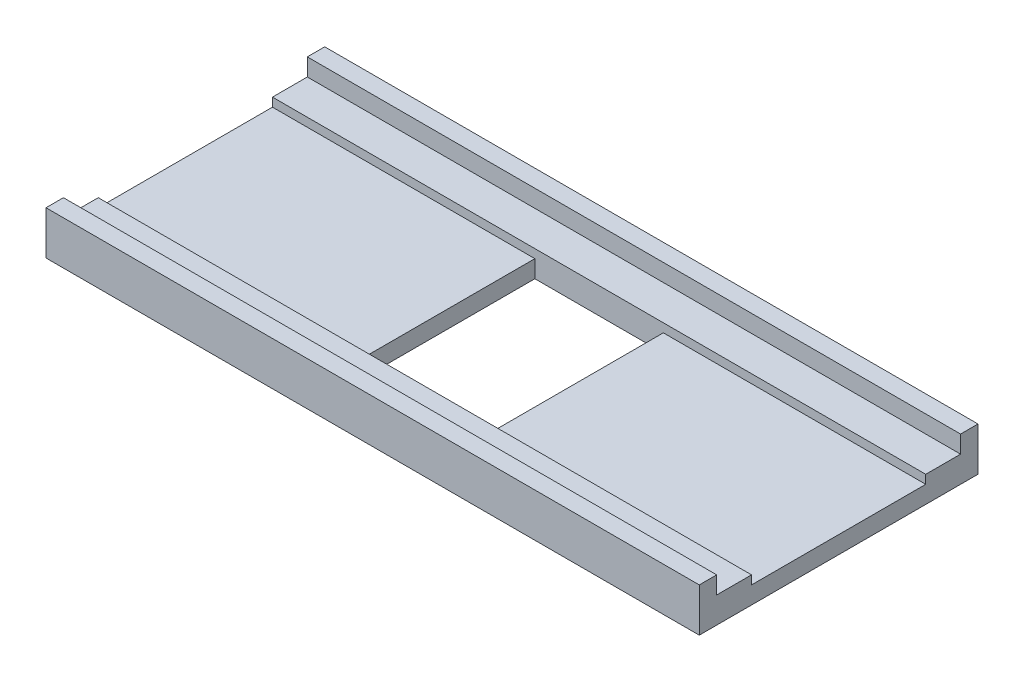
ISO-10303-21;
HEADER;
FILE_DESCRIPTION(('STEP AP214'),'2;1');
FILE_NAME('part.step','',(''),(''),'','','');
FILE_SCHEMA(('AUTOMOTIVE_DESIGN { 1 0 10303 214 1 1 1 1 }'));
ENDSEC;
DATA;
#1=APPLICATION_CONTEXT('core data for automotive mechanical design processes');
#2=APPLICATION_PROTOCOL_DEFINITION('international standard','automotive_design',2000,#1);
#3=PRODUCT_CONTEXT('',#1,'mechanical');
#4=PRODUCT('Part','Part','',(#3));
#5=PRODUCT_RELATED_PRODUCT_CATEGORY('part','',(#4));
#6=PRODUCT_DEFINITION_FORMATION('','',#4);
#7=PRODUCT_DEFINITION_CONTEXT('part definition',#1,'design');
#8=PRODUCT_DEFINITION('design','',#6,#7);
#9=PRODUCT_DEFINITION_SHAPE('','',#8);
#10=(LENGTH_UNIT() NAMED_UNIT(*) SI_UNIT(.MILLI.,.METRE.));
#11=(NAMED_UNIT(*) PLANE_ANGLE_UNIT() SI_UNIT($,.RADIAN.));
#12=(NAMED_UNIT(*) SI_UNIT($,.STERADIAN.) SOLID_ANGLE_UNIT());
#13=UNCERTAINTY_MEASURE_WITH_UNIT(LENGTH_MEASURE(1.E-05),#10,'distance_accuracy_value','');
#14=(GEOMETRIC_REPRESENTATION_CONTEXT(3) GLOBAL_UNCERTAINTY_ASSIGNED_CONTEXT((#13)) GLOBAL_UNIT_ASSIGNED_CONTEXT((#10,
#11,#12)) REPRESENTATION_CONTEXT('',''));
#15=CARTESIAN_POINT('',(0.,0.,0.));
#16=DIRECTION('',(0.,0.,1.));
#17=DIRECTION('',(1.,0.,0.));
#18=AXIS2_PLACEMENT_3D('',#15,#16,#17);
#19=CARTESIAN_POINT('',(37.5,3.,16.));
#20=DIRECTION('',(0.,1.,0.));
#21=DIRECTION('',(0.,0.,1.));
#22=AXIS2_PLACEMENT_3D('',#19,#20,#21);
#23=PLANE('',#22);
#24=DIRECTION('',(-1.,0.,0.));
#25=VECTOR('',#24,1.);
#26=CARTESIAN_POINT('',(-7.375,3.,-10.));
#27=LINE('',#26,#25);
#28=CARTESIAN_POINT('',(37.5,3.,-10.));
#29=VERTEX_POINT('',#28);
#30=CARTESIAN_POINT('',(-37.5,3.,-10.));
#31=VERTEX_POINT('',#30);
#32=EDGE_CURVE('E183',#29,#31,#27,.T.);
#33=ORIENTED_EDGE('',*,*,#32,.F.);
#34=DIRECTION('',(0.,0.,-1.));
#35=VECTOR('',#34,1.);
#36=CARTESIAN_POINT('',(37.5,3.,-16.));
#37=LINE('',#36,#35);
#38=CARTESIAN_POINT('',(37.5,3.,-14.));
#39=VERTEX_POINT('',#38);
#40=EDGE_CURVE('E37',#29,#39,#37,.T.);
#41=ORIENTED_EDGE('',*,*,#40,.T.);
#42=DIRECTION('',(1.,0.,0.));
#43=VECTOR('',#42,1.);
#44=CARTESIAN_POINT('',(-37.5,3.,-14.));
#45=LINE('',#44,#43);
#46=CARTESIAN_POINT('',(-37.5,3.,-14.));
#47=VERTEX_POINT('',#46);
#48=EDGE_CURVE('E218',#47,#39,#45,.T.);
#49=ORIENTED_EDGE('',*,*,#48,.F.);
#50=DIRECTION('',(0.,0.,1.));
#51=VECTOR('',#50,1.);
#52=CARTESIAN_POINT('',(-37.5,3.,-16.));
#53=LINE('',#52,#51);
#54=EDGE_CURVE('E248',#47,#31,#53,.T.);
#55=ORIENTED_EDGE('',*,*,#54,.T.);
#56=EDGE_LOOP('',(#33,#41,#49,#55));
#57=FACE_BOUND('',#56,.T.);
#58=ADVANCED_FACE('F33',(#57),#23,.T.);
#59=CARTESIAN_POINT('',(7.375,0.,-10.));
#60=DIRECTION('',(1.,0.,0.));
#61=DIRECTION('',(0.,0.,-1.));
#62=AXIS2_PLACEMENT_3D('',#59,#60,#61);
#63=PLANE('',#62);
#64=DIRECTION('',(0.,0.,1.));
#65=VECTOR('',#64,1.);
#66=CARTESIAN_POINT('',(7.375,2.,-10.));
#67=LINE('',#66,#65);
#68=CARTESIAN_POINT('',(7.375,2.,-10.));
#69=VERTEX_POINT('',#68);
#70=CARTESIAN_POINT('',(7.375,2.,10.));
#71=VERTEX_POINT('',#70);
#72=EDGE_CURVE('E180',#69,#71,#67,.T.);
#73=ORIENTED_EDGE('',*,*,#72,.F.);
#74=DIRECTION('',(0.,1.,0.));
#75=VECTOR('',#74,1.);
#76=CARTESIAN_POINT('',(7.375,0.,-10.));
#77=LINE('',#76,#75);
#78=CARTESIAN_POINT('',(7.375,0.,-10.));
#79=VERTEX_POINT('',#78);
#80=EDGE_CURVE('E197',#79,#69,#77,.T.);
#81=ORIENTED_EDGE('',*,*,#80,.F.);
#82=DIRECTION('',(0.,0.,-1.));
#83=VECTOR('',#82,1.);
#84=CARTESIAN_POINT('',(7.375,0.,-10.));
#85=LINE('',#84,#83);
#86=CARTESIAN_POINT('',(7.375,0.,10.));
#87=VERTEX_POINT('',#86);
#88=EDGE_CURVE('E184',#87,#79,#85,.T.);
#89=ORIENTED_EDGE('',*,*,#88,.F.);
#90=DIRECTION('',(0.,1.,0.));
#91=VECTOR('',#90,1.);
#92=CARTESIAN_POINT('',(7.375,0.,10.));
#93=LINE('',#92,#91);
#94=EDGE_CURVE('E200',#87,#71,#93,.T.);
#95=ORIENTED_EDGE('',*,*,#94,.T.);
#96=EDGE_LOOP('',(#73,#81,#89,#95));
#97=FACE_BOUND('',#96,.T.);
#98=ADVANCED_FACE('F310',(#97),#63,.F.);
#99=CARTESIAN_POINT('',(-7.375,0.,-10.));
#100=DIRECTION('',(-1.,0.,0.));
#101=DIRECTION('',(0.,0.,1.));
#102=AXIS2_PLACEMENT_3D('',#99,#100,#101);
#103=PLANE('',#102);
#104=DIRECTION('',(0.,0.,-1.));
#105=VECTOR('',#104,1.);
#106=CARTESIAN_POINT('',(-7.375,2.,-10.));
#107=LINE('',#106,#105);
#108=CARTESIAN_POINT('',(-7.375,2.,10.));
#109=VERTEX_POINT('',#108);
#110=CARTESIAN_POINT('',(-7.375,2.,-10.));
#111=VERTEX_POINT('',#110);
#112=EDGE_CURVE('E178',#109,#111,#107,.T.);
#113=ORIENTED_EDGE('',*,*,#112,.F.);
#114=DIRECTION('',(0.,1.,0.));
#115=VECTOR('',#114,1.);
#116=CARTESIAN_POINT('',(-7.375,0.,10.));
#117=LINE('',#116,#115);
#118=CARTESIAN_POINT('',(-7.375,0.,10.));
#119=VERTEX_POINT('',#118);
#120=EDGE_CURVE('E154',#119,#109,#117,.T.);
#121=ORIENTED_EDGE('',*,*,#120,.F.);
#122=DIRECTION('',(0.,0.,1.));
#123=VECTOR('',#122,1.);
#124=CARTESIAN_POINT('',(-7.375,0.,-10.));
#125=LINE('',#124,#123);
#126=CARTESIAN_POINT('',(-7.37499999999999,0.,-10.));
#127=VERTEX_POINT('',#126);
#128=EDGE_CURVE('E191',#127,#119,#125,.T.);
#129=ORIENTED_EDGE('',*,*,#128,.F.);
#130=DIRECTION('',(0.,1.,0.));
#131=VECTOR('',#130,1.);
#132=CARTESIAN_POINT('',(-7.375,0.,-10.));
#133=LINE('',#132,#131);
#134=EDGE_CURVE('E205',#127,#111,#133,.T.);
#135=ORIENTED_EDGE('',*,*,#134,.T.);
#136=EDGE_LOOP('',(#113,#121,#129,#135));
#137=FACE_BOUND('',#136,.T.);
#138=ADVANCED_FACE('F315',(#137),#103,.F.);
#139=DIRECTION('',(1.,0.,0.));
#140=VECTOR('',#139,1.);
#141=CARTESIAN_POINT('',(-7.375,3.,10.));
#142=LINE('',#141,#140);
#143=CARTESIAN_POINT('',(-37.5,3.,10.));
#144=VERTEX_POINT('',#143);
#145=CARTESIAN_POINT('',(37.5,3.,10.));
#146=VERTEX_POINT('',#145);
#147=EDGE_CURVE('E188',#144,#146,#142,.T.);
#148=ORIENTED_EDGE('',*,*,#147,.F.);
#149=CARTESIAN_POINT('',(-37.5,3.,14.));
#150=VERTEX_POINT('',#149);
#151=EDGE_CURVE('E169',#144,#150,#53,.T.);
#152=ORIENTED_EDGE('',*,*,#151,.T.);
#153=DIRECTION('',(-1.,0.,0.));
#154=VECTOR('',#153,1.);
#155=CARTESIAN_POINT('',(-37.5,3.,14.));
#156=LINE('',#155,#154);
#157=CARTESIAN_POINT('',(37.5,3.,14.));
#158=VERTEX_POINT('',#157);
#159=EDGE_CURVE('E210',#158,#150,#156,.T.);
#160=ORIENTED_EDGE('',*,*,#159,.F.);
#161=EDGE_CURVE('E259',#158,#146,#37,.T.);
#162=ORIENTED_EDGE('',*,*,#161,.T.);
#163=EDGE_LOOP('',(#148,#152,#160,#162));
#164=FACE_BOUND('',#163,.T.);
#165=ADVANCED_FACE('F303',(#164),#23,.T.);
#166=CARTESIAN_POINT('',(37.5,3.,-16.));
#167=DIRECTION('',(-1.,0.,0.));
#168=DIRECTION('',(0.,0.,1.));
#169=AXIS2_PLACEMENT_3D('',#166,#167,#168);
#170=PLANE('',#169);
#171=ORIENTED_EDGE('',*,*,#40,.F.);
#172=DIRECTION('',(0.,1.,0.));
#173=VECTOR('',#172,1.);
#174=CARTESIAN_POINT('',(37.5,2.,-10.));
#175=LINE('',#174,#173);
#176=CARTESIAN_POINT('',(37.5,2.,-10.));
#177=VERTEX_POINT('',#176);
#178=EDGE_CURVE('E173',#177,#29,#175,.T.);
#179=ORIENTED_EDGE('',*,*,#178,.F.);
#180=DIRECTION('',(0.,0.,-1.));
#181=VECTOR('',#180,1.);
#182=CARTESIAN_POINT('',(37.5,2.,-10.));
#183=LINE('',#182,#181);
#184=CARTESIAN_POINT('',(37.5,2.,10.));
#185=VERTEX_POINT('',#184);
#186=EDGE_CURVE('E155',#185,#177,#183,.T.);
#187=ORIENTED_EDGE('',*,*,#186,.F.);
#188=DIRECTION('',(0.,1.,0.));
#189=VECTOR('',#188,1.);
#190=CARTESIAN_POINT('',(37.5,2.,10.));
#191=LINE('',#190,#189);
#192=EDGE_CURVE('E170',#185,#146,#191,.T.);
#193=ORIENTED_EDGE('',*,*,#192,.T.);
#194=ORIENTED_EDGE('',*,*,#161,.F.);
#195=DIRECTION('',(0.,-1.,0.));
#196=VECTOR('',#195,1.);
#197=CARTESIAN_POINT('',(37.5,80.0266619276108,14.));
#198=LINE('',#197,#196);
#199=CARTESIAN_POINT('',(37.5,5.,14.));
#200=VERTEX_POINT('',#199);
#201=EDGE_CURVE('E214',#200,#158,#198,.T.);
#202=ORIENTED_EDGE('',*,*,#201,.F.);
#203=DIRECTION('',(0.,0.,-1.));
#204=VECTOR('',#203,1.);
#205=CARTESIAN_POINT('',(37.5,5.,16.));
#206=LINE('',#205,#204);
#207=CARTESIAN_POINT('',(37.5,5.,16.));
#208=VERTEX_POINT('',#207);
#209=EDGE_CURVE('E215',#208,#200,#206,.T.);
#210=ORIENTED_EDGE('',*,*,#209,.F.);
#211=DIRECTION('',(0.,-1.,0.));
#212=VECTOR('',#211,1.);
#213=CARTESIAN_POINT('',(37.5,3.,16.));
#214=LINE('',#213,#212);
#215=CARTESIAN_POINT('',(37.5,0.,16.));
#216=VERTEX_POINT('',#215);
#217=EDGE_CURVE('E272',#208,#216,#214,.T.);
#218=ORIENTED_EDGE('',*,*,#217,.T.);
#219=DIRECTION('',(0.,0.,-1.));
#220=VECTOR('',#219,1.);
#221=CARTESIAN_POINT('',(37.5,0.,-16.));
#222=LINE('',#221,#220);
#223=CARTESIAN_POINT('',(37.5,0.,-16.));
#224=VERTEX_POINT('',#223);
#225=EDGE_CURVE('E256',#216,#224,#222,.T.);
#226=ORIENTED_EDGE('',*,*,#225,.T.);
#227=DIRECTION('',(0.,-1.,0.));
#228=VECTOR('',#227,1.);
#229=CARTESIAN_POINT('',(37.5,3.,-16.));
#230=LINE('',#229,#228);
#231=CARTESIAN_POINT('',(37.5,5.,-16.));
#232=VERTEX_POINT('',#231);
#233=EDGE_CURVE('E11',#232,#224,#230,.T.);
#234=ORIENTED_EDGE('',*,*,#233,.F.);
#235=DIRECTION('',(0.,0.,-1.));
#236=VECTOR('',#235,1.);
#237=CARTESIAN_POINT('',(37.5,5.,-16.));
#238=LINE('',#237,#236);
#239=CARTESIAN_POINT('',(37.5,5.,-14.));
#240=VERTEX_POINT('',#239);
#241=EDGE_CURVE('E234',#240,#232,#238,.T.);
#242=ORIENTED_EDGE('',*,*,#241,.F.);
#243=DIRECTION('',(0.,-1.,0.));
#244=VECTOR('',#243,1.);
#245=CARTESIAN_POINT('',(37.5,5.,-14.));
#246=LINE('',#245,#244);
#247=EDGE_CURVE('E240',#240,#39,#246,.T.);
#248=ORIENTED_EDGE('',*,*,#247,.T.);
#249=EDGE_LOOP('',(#171,#179,#187,#193,#194,#202,#210,#218,#226,#234,#242,#248));
#250=FACE_BOUND('',#249,.T.);
#251=ADVANCED_FACE('F35',(#250),#170,.F.);
#252=CARTESIAN_POINT('',(-37.5,3.,-16.));
#253=DIRECTION('',(0.,0.,1.));
#254=DIRECTION('',(1.,0.,0.));
#255=AXIS2_PLACEMENT_3D('',#252,#253,#254);
#256=PLANE('',#255);
#257=DIRECTION('',(-1.,0.,0.));
#258=VECTOR('',#257,1.);
#259=CARTESIAN_POINT('',(-37.5,0.,-16.));
#260=LINE('',#259,#258);
#261=CARTESIAN_POINT('',(-37.5,0.,-16.));
#262=VERTEX_POINT('',#261);
#263=EDGE_CURVE('E266',#224,#262,#260,.T.);
#264=ORIENTED_EDGE('',*,*,#263,.T.);
#265=DIRECTION('',(0.,-1.,0.));
#266=VECTOR('',#265,1.);
#267=CARTESIAN_POINT('',(-37.5,3.,-16.));
#268=LINE('',#267,#266);
#269=CARTESIAN_POINT('',(-37.5,5.,-16.));
#270=VERTEX_POINT('',#269);
#271=EDGE_CURVE('E43',#270,#262,#268,.T.);
#272=ORIENTED_EDGE('',*,*,#271,.F.);
#273=DIRECTION('',(-1.,0.,0.));
#274=VECTOR('',#273,1.);
#275=CARTESIAN_POINT('',(-37.5,5.,-16.));
#276=LINE('',#275,#274);
#277=EDGE_CURVE('E237',#232,#270,#276,.T.);
#278=ORIENTED_EDGE('',*,*,#277,.F.);
#279=ORIENTED_EDGE('',*,*,#233,.T.);
#280=EDGE_LOOP('',(#264,#272,#278,#279));
#281=FACE_BOUND('',#280,.T.);
#282=ADVANCED_FACE('F330',(#281),#256,.F.);
#283=CARTESIAN_POINT('',(-37.5,3.,-16.));
#284=DIRECTION('',(1.,0.,0.));
#285=DIRECTION('',(0.,0.,-1.));
#286=AXIS2_PLACEMENT_3D('',#283,#284,#285);
#287=PLANE('',#286);
#288=DIRECTION('',(0.,0.,1.));
#289=VECTOR('',#288,1.);
#290=CARTESIAN_POINT('',(-37.5,2.,-10.));
#291=LINE('',#290,#289);
#292=CARTESIAN_POINT('',(-37.5,2.,-10.));
#293=VERTEX_POINT('',#292);
#294=CARTESIAN_POINT('',(-37.5,2.,10.));
#295=VERTEX_POINT('',#294);
#296=EDGE_CURVE('E159',#293,#295,#291,.T.);
#297=ORIENTED_EDGE('',*,*,#296,.F.);
#298=DIRECTION('',(0.,1.,0.));
#299=VECTOR('',#298,1.);
#300=CARTESIAN_POINT('',(-37.5,2.,-10.));
#301=LINE('',#300,#299);
#302=EDGE_CURVE('E181',#293,#31,#301,.T.);
#303=ORIENTED_EDGE('',*,*,#302,.T.);
#304=ORIENTED_EDGE('',*,*,#54,.F.);
#305=DIRECTION('',(0.,-1.,0.));
#306=VECTOR('',#305,1.);
#307=CARTESIAN_POINT('',(-37.5,5.,-14.));
#308=LINE('',#307,#306);
#309=CARTESIAN_POINT('',(-37.5,5.,-14.));
#310=VERTEX_POINT('',#309);
#311=EDGE_CURVE('E251',#310,#47,#308,.T.);
#312=ORIENTED_EDGE('',*,*,#311,.F.);
#313=DIRECTION('',(0.,0.,1.));
#314=VECTOR('',#313,1.);
#315=CARTESIAN_POINT('',(-37.5,5.,-16.));
#316=LINE('',#315,#314);
#317=EDGE_CURVE('E229',#270,#310,#316,.T.);
#318=ORIENTED_EDGE('',*,*,#317,.F.);
#319=ORIENTED_EDGE('',*,*,#271,.T.);
#320=DIRECTION('',(0.,0.,1.));
#321=VECTOR('',#320,1.);
#322=CARTESIAN_POINT('',(-37.5,0.,-16.));
#323=LINE('',#322,#321);
#324=CARTESIAN_POINT('',(-37.5,0.,16.));
#325=VERTEX_POINT('',#324);
#326=EDGE_CURVE('E268',#262,#325,#323,.T.);
#327=ORIENTED_EDGE('',*,*,#326,.T.);
#328=DIRECTION('',(0.,-1.,0.));
#329=VECTOR('',#328,1.);
#330=CARTESIAN_POINT('',(-37.5,3.,16.));
#331=LINE('',#330,#329);
#332=CARTESIAN_POINT('',(-37.5,5.,16.));
#333=VERTEX_POINT('',#332);
#334=EDGE_CURVE('E275',#333,#325,#331,.T.);
#335=ORIENTED_EDGE('',*,*,#334,.F.);
#336=DIRECTION('',(0.,0.,1.));
#337=VECTOR('',#336,1.);
#338=CARTESIAN_POINT('',(-37.5,5.,16.));
#339=LINE('',#338,#337);
#340=CARTESIAN_POINT('',(-37.5,5.,14.));
#341=VERTEX_POINT('',#340);
#342=EDGE_CURVE('E222',#341,#333,#339,.T.);
#343=ORIENTED_EDGE('',*,*,#342,.F.);
#344=DIRECTION('',(0.,-1.,0.));
#345=VECTOR('',#344,1.);
#346=CARTESIAN_POINT('',(-37.5,80.0266619276108,14.));
#347=LINE('',#346,#345);
#348=EDGE_CURVE('E203',#341,#150,#347,.T.);
#349=ORIENTED_EDGE('',*,*,#348,.T.);
#350=ORIENTED_EDGE('',*,*,#151,.F.);
#351=DIRECTION('',(0.,1.,0.));
#352=VECTOR('',#351,1.);
#353=CARTESIAN_POINT('',(-37.5,2.,10.));
#354=LINE('',#353,#352);
#355=EDGE_CURVE('E151',#295,#144,#354,.T.);
#356=ORIENTED_EDGE('',*,*,#355,.F.);
#357=EDGE_LOOP('',(#297,#303,#304,#312,#318,#319,#327,#335,#343,#349,#350,#356));
#358=FACE_BOUND('',#357,.T.);
#359=ADVANCED_FACE('F167',(#358),#287,.F.);
#360=CARTESIAN_POINT('',(-37.5,3.,16.));
#361=DIRECTION('',(0.,0.,-1.));
#362=DIRECTION('',(-1.,0.,0.));
#363=AXIS2_PLACEMENT_3D('',#360,#361,#362);
#364=PLANE('',#363);
#365=DIRECTION('',(1.,0.,0.));
#366=VECTOR('',#365,1.);
#367=CARTESIAN_POINT('',(-37.5,0.,16.));
#368=LINE('',#367,#366);
#369=EDGE_CURVE('E270',#325,#216,#368,.T.);
#370=ORIENTED_EDGE('',*,*,#369,.T.);
#371=ORIENTED_EDGE('',*,*,#217,.F.);
#372=DIRECTION('',(1.,0.,0.));
#373=VECTOR('',#372,1.);
#374=CARTESIAN_POINT('',(-37.5,5.,16.));
#375=LINE('',#374,#373);
#376=EDGE_CURVE('E219',#333,#208,#375,.T.);
#377=ORIENTED_EDGE('',*,*,#376,.F.);
#378=ORIENTED_EDGE('',*,*,#334,.T.);
#379=EDGE_LOOP('',(#370,#371,#377,#378));
#380=FACE_BOUND('',#379,.T.);
#381=ADVANCED_FACE('F289',(#380),#364,.F.);
#382=CARTESIAN_POINT('',(37.5,0.,16.));
#383=DIRECTION('',(0.,1.,0.));
#384=DIRECTION('',(0.,0.,1.));
#385=AXIS2_PLACEMENT_3D('',#382,#383,#384);
#386=PLANE('',#385);
#387=DIRECTION('',(1.,0.,0.));
#388=VECTOR('',#387,1.);
#389=CARTESIAN_POINT('',(-7.375,0.,10.));
#390=LINE('',#389,#388);
#391=EDGE_CURVE('E194',#119,#87,#390,.T.);
#392=ORIENTED_EDGE('',*,*,#391,.T.);
#393=ORIENTED_EDGE('',*,*,#88,.T.);
#394=DIRECTION('',(-1.,0.,0.));
#395=VECTOR('',#394,1.);
#396=CARTESIAN_POINT('',(-7.375,0.,-10.));
#397=LINE('',#396,#395);
#398=EDGE_CURVE('E187',#79,#127,#397,.T.);
#399=ORIENTED_EDGE('',*,*,#398,.T.);
#400=ORIENTED_EDGE('',*,*,#128,.T.);
#401=EDGE_LOOP('',(#392,#393,#399,#400));
#402=FACE_BOUND('',#401,.T.);
#403=ORIENTED_EDGE('',*,*,#225,.F.);
#404=ORIENTED_EDGE('',*,*,#369,.F.);
#405=ORIENTED_EDGE('',*,*,#326,.F.);
#406=ORIENTED_EDGE('',*,*,#263,.F.);
#407=EDGE_LOOP('',(#403,#404,#405,#406));
#408=FACE_BOUND('',#407,.T.);
#409=ADVANCED_FACE('F287',(#402,#408),#386,.F.);
#410=CARTESIAN_POINT('',(-37.5,5.,-14.));
#411=DIRECTION('',(0.,0.,-1.));
#412=DIRECTION('',(-1.,0.,0.));
#413=AXIS2_PLACEMENT_3D('',#410,#411,#412);
#414=PLANE('',#413);
#415=ORIENTED_EDGE('',*,*,#48,.T.);
#416=ORIENTED_EDGE('',*,*,#247,.F.);
#417=DIRECTION('',(1.,0.,0.));
#418=VECTOR('',#417,1.);
#419=CARTESIAN_POINT('',(-37.5,5.,-14.));
#420=LINE('',#419,#418);
#421=EDGE_CURVE('E232',#310,#240,#420,.T.);
#422=ORIENTED_EDGE('',*,*,#421,.F.);
#423=ORIENTED_EDGE('',*,*,#311,.T.);
#424=EDGE_LOOP('',(#415,#416,#422,#423));
#425=FACE_BOUND('',#424,.T.);
#426=ADVANCED_FACE('F327',(#425),#414,.F.);
#427=CARTESIAN_POINT('',(-37.5,5.,-14.));
#428=DIRECTION('',(0.,1.,0.));
#429=DIRECTION('',(0.,0.,1.));
#430=AXIS2_PLACEMENT_3D('',#427,#428,#429);
#431=PLANE('',#430);
#432=ORIENTED_EDGE('',*,*,#317,.T.);
#433=ORIENTED_EDGE('',*,*,#421,.T.);
#434=ORIENTED_EDGE('',*,*,#241,.T.);
#435=ORIENTED_EDGE('',*,*,#277,.T.);
#436=EDGE_LOOP('',(#432,#433,#434,#435));
#437=FACE_BOUND('',#436,.T.);
#438=ADVANCED_FACE('F329',(#437),#431,.T.);
#439=CARTESIAN_POINT('',(-37.5,80.0266619276108,14.));
#440=DIRECTION('',(0.,0.,1.));
#441=DIRECTION('',(1.,0.,0.));
#442=AXIS2_PLACEMENT_3D('',#439,#440,#441);
#443=PLANE('',#442);
#444=DIRECTION('',(-1.,0.,0.));
#445=VECTOR('',#444,1.);
#446=CARTESIAN_POINT('',(-37.5,5.,14.));
#447=LINE('',#446,#445);
#448=EDGE_CURVE('E213',#200,#341,#447,.T.);
#449=ORIENTED_EDGE('',*,*,#448,.F.);
#450=ORIENTED_EDGE('',*,*,#201,.T.);
#451=ORIENTED_EDGE('',*,*,#159,.T.);
#452=ORIENTED_EDGE('',*,*,#348,.F.);
#453=EDGE_LOOP('',(#449,#450,#451,#452));
#454=FACE_BOUND('',#453,.T.);
#455=ADVANCED_FACE('F301',(#454),#443,.F.);
#456=CARTESIAN_POINT('',(-37.5,5.,-14.));
#457=DIRECTION('',(0.,1.,0.));
#458=DIRECTION('',(0.,0.,1.));
#459=AXIS2_PLACEMENT_3D('',#456,#457,#458);
#460=PLANE('',#459);
#461=ORIENTED_EDGE('',*,*,#448,.T.);
#462=ORIENTED_EDGE('',*,*,#342,.T.);
#463=ORIENTED_EDGE('',*,*,#376,.T.);
#464=ORIENTED_EDGE('',*,*,#209,.T.);
#465=EDGE_LOOP('',(#461,#462,#463,#464));
#466=FACE_BOUND('',#465,.T.);
#467=ADVANCED_FACE('F297',(#466),#460,.T.);
#468=CARTESIAN_POINT('',(-7.375,0.,10.));
#469=DIRECTION('',(0.,0.,1.));
#470=DIRECTION('',(1.,0.,0.));
#471=AXIS2_PLACEMENT_3D('',#468,#469,#470);
#472=PLANE('',#471);
#473=ORIENTED_EDGE('',*,*,#147,.T.);
#474=ORIENTED_EDGE('',*,*,#192,.F.);
#475=DIRECTION('',(1.,0.,0.));
#476=VECTOR('',#475,1.);
#477=CARTESIAN_POINT('',(-37.5,2.,10.));
#478=LINE('',#477,#476);
#479=EDGE_CURVE('E156',#71,#185,#478,.T.);
#480=ORIENTED_EDGE('',*,*,#479,.F.);
#481=ORIENTED_EDGE('',*,*,#94,.F.);
#482=ORIENTED_EDGE('',*,*,#391,.F.);
#483=ORIENTED_EDGE('',*,*,#120,.T.);
#484=EDGE_CURVE('E51',#295,#109,#478,.T.);
#485=ORIENTED_EDGE('',*,*,#484,.F.);
#486=ORIENTED_EDGE('',*,*,#355,.T.);
#487=EDGE_LOOP('',(#473,#474,#480,#481,#482,#483,#485,#486));
#488=FACE_BOUND('',#487,.T.);
#489=ADVANCED_FACE('F149',(#488),#472,.F.);
#490=CARTESIAN_POINT('',(-7.375,0.,-10.));
#491=DIRECTION('',(0.,0.,-1.));
#492=DIRECTION('',(-1.,0.,0.));
#493=AXIS2_PLACEMENT_3D('',#490,#491,#492);
#494=PLANE('',#493);
#495=ORIENTED_EDGE('',*,*,#32,.T.);
#496=ORIENTED_EDGE('',*,*,#302,.F.);
#497=DIRECTION('',(-1.,0.,0.));
#498=VECTOR('',#497,1.);
#499=CARTESIAN_POINT('',(-37.5,2.,-10.));
#500=LINE('',#499,#498);
#501=EDGE_CURVE('E162',#111,#293,#500,.T.);
#502=ORIENTED_EDGE('',*,*,#501,.F.);
#503=ORIENTED_EDGE('',*,*,#134,.F.);
#504=ORIENTED_EDGE('',*,*,#398,.F.);
#505=ORIENTED_EDGE('',*,*,#80,.T.);
#506=EDGE_CURVE('E59',#177,#69,#500,.T.);
#507=ORIENTED_EDGE('',*,*,#506,.F.);
#508=ORIENTED_EDGE('',*,*,#178,.T.);
#509=EDGE_LOOP('',(#495,#496,#502,#503,#504,#505,#507,#508));
#510=FACE_BOUND('',#509,.T.);
#511=ADVANCED_FACE('F317',(#510),#494,.F.);
#512=CARTESIAN_POINT('',(-37.5,2.,10.));
#513=DIRECTION('',(0.,1.,0.));
#514=DIRECTION('',(0.,0.,1.));
#515=AXIS2_PLACEMENT_3D('',#512,#513,#514);
#516=PLANE('',#515);
#517=ORIENTED_EDGE('',*,*,#112,.T.);
#518=ORIENTED_EDGE('',*,*,#501,.T.);
#519=ORIENTED_EDGE('',*,*,#296,.T.);
#520=ORIENTED_EDGE('',*,*,#484,.T.);
#521=EDGE_LOOP('',(#517,#518,#519,#520));
#522=FACE_BOUND('',#521,.T.);
#523=ADVANCED_FACE('F160',(#522),#516,.T.);
#524=ORIENTED_EDGE('',*,*,#72,.T.);
#525=ORIENTED_EDGE('',*,*,#479,.T.);
#526=ORIENTED_EDGE('',*,*,#186,.T.);
#527=ORIENTED_EDGE('',*,*,#506,.T.);
#528=EDGE_LOOP('',(#524,#525,#526,#527));
#529=FACE_BOUND('',#528,.T.);
#530=ADVANCED_FACE('F407',(#529),#516,.T.);
#531=CLOSED_SHELL('',(#58,#98,#138,#165,#251,#282,#359,#381,#409,#426,#438,#455,#467,#489,#511,
#523,#530));
#532=MANIFOLD_SOLID_BREP('B2',#531);
#533=ADVANCED_BREP_SHAPE_REPRESENTATION('',(#18,#532),#14);
#534=SHAPE_DEFINITION_REPRESENTATION(#9,#533);
ENDSEC;
END-ISO-10303-21;
